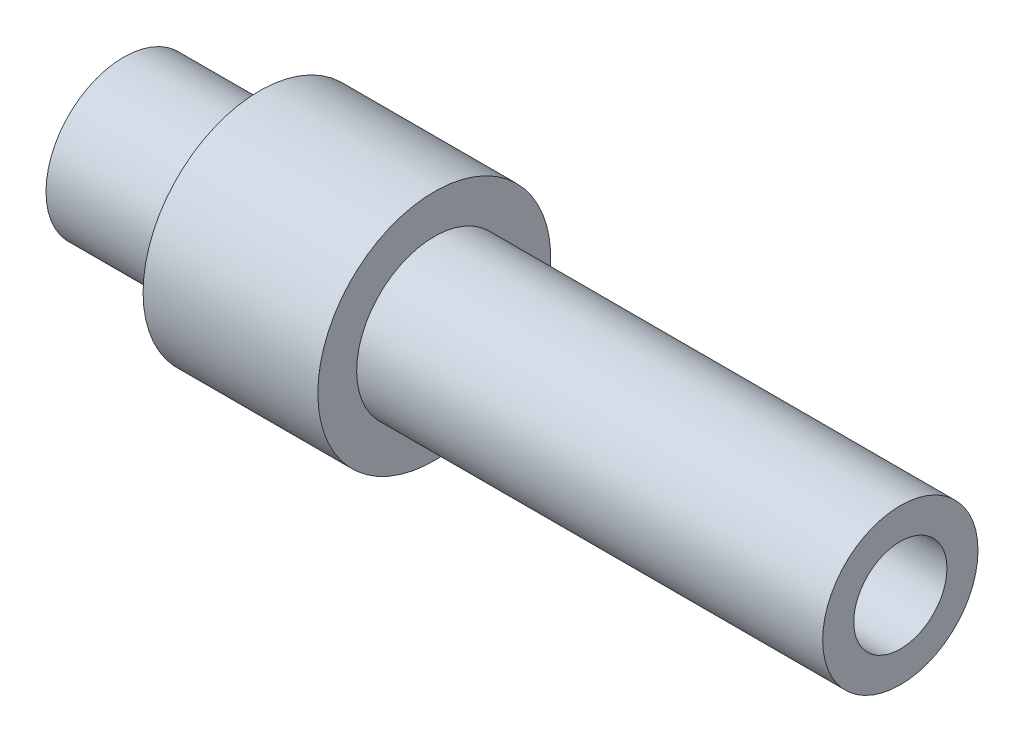
ISO-10303-21;
HEADER;
FILE_DESCRIPTION(('STEP AP214'),'2;1');
FILE_NAME('part.step','',(''),(''),'','','');
FILE_SCHEMA(('AUTOMOTIVE_DESIGN { 1 0 10303 214 1 1 1 1 }'));
ENDSEC;
DATA;
#1=APPLICATION_CONTEXT('core data for automotive mechanical design processes');
#2=APPLICATION_PROTOCOL_DEFINITION('international standard','automotive_design',2000,#1);
#3=PRODUCT_CONTEXT('',#1,'mechanical');
#4=PRODUCT('Part','Part','',(#3));
#5=PRODUCT_RELATED_PRODUCT_CATEGORY('part','',(#4));
#6=PRODUCT_DEFINITION_FORMATION('','',#4);
#7=PRODUCT_DEFINITION_CONTEXT('part definition',#1,'design');
#8=PRODUCT_DEFINITION('design','',#6,#7);
#9=PRODUCT_DEFINITION_SHAPE('','',#8);
#10=(LENGTH_UNIT() NAMED_UNIT(*) SI_UNIT(.MILLI.,.METRE.));
#11=(NAMED_UNIT(*) PLANE_ANGLE_UNIT() SI_UNIT($,.RADIAN.));
#12=(NAMED_UNIT(*) SI_UNIT($,.STERADIAN.) SOLID_ANGLE_UNIT());
#13=UNCERTAINTY_MEASURE_WITH_UNIT(LENGTH_MEASURE(1.E-05),#10,'distance_accuracy_value','');
#14=(GEOMETRIC_REPRESENTATION_CONTEXT(3) GLOBAL_UNCERTAINTY_ASSIGNED_CONTEXT((#13)) GLOBAL_UNIT_ASSIGNED_CONTEXT((#10,
#11,#12)) REPRESENTATION_CONTEXT('',''));
#15=CARTESIAN_POINT('',(0.,0.,0.));
#16=DIRECTION('',(0.,0.,1.));
#17=DIRECTION('',(1.,0.,0.));
#18=AXIS2_PLACEMENT_3D('',#15,#16,#17);
#19=CARTESIAN_POINT('',(40.,0.,0.));
#20=DIRECTION('',(-1.,0.,0.));
#21=DIRECTION('',(0.,0.,1.));
#22=AXIS2_PLACEMENT_3D('',#19,#20,#21);
#23=CYLINDRICAL_SURFACE('',#22,4.);
#24=CARTESIAN_POINT('',(7.,0.,0.));
#25=DIRECTION('',(-1.,0.,0.));
#26=DIRECTION('',(0.,0.,1.));
#27=AXIS2_PLACEMENT_3D('',#24,#25,#26);
#28=CIRCLE('',#27,4.);
#29=CARTESIAN_POINT('',(7.,0.,4.));
#30=VERTEX_POINT('',#29);
#31=EDGE_CURVE('E59',#30,#30,#28,.T.);
#32=ORIENTED_EDGE('',*,*,#31,.T.);
#33=EDGE_LOOP('',(#32));
#34=FACE_BOUND('',#33,.T.);
#35=CARTESIAN_POINT('',(0.,0.,0.));
#36=DIRECTION('',(1.,0.,0.));
#37=DIRECTION('',(0.,0.,-1.));
#38=AXIS2_PLACEMENT_3D('',#35,#36,#37);
#39=CIRCLE('',#38,4.);
#40=CARTESIAN_POINT('',(0.,0.,-4.));
#41=VERTEX_POINT('',#40);
#42=EDGE_CURVE('E49',#41,#41,#39,.T.);
#43=ORIENTED_EDGE('',*,*,#42,.T.);
#44=EDGE_LOOP('',(#43));
#45=FACE_BOUND('',#44,.T.);
#46=ADVANCED_FACE('F39',(#34,#45),#23,.T.);
#47=CARTESIAN_POINT('',(0.,0.,0.));
#48=DIRECTION('',(1.,0.,0.));
#49=DIRECTION('',(0.,0.,-1.));
#50=AXIS2_PLACEMENT_3D('',#47,#48,#49);
#51=PLANE('',#50);
#52=CARTESIAN_POINT('',(0.,0.,0.));
#53=DIRECTION('',(-1.,0.,0.));
#54=DIRECTION('',(0.,0.,1.));
#55=AXIS2_PLACEMENT_3D('',#52,#53,#54);
#56=CIRCLE('',#55,2.);
#57=CARTESIAN_POINT('',(0.,0.,2.));
#58=VERTEX_POINT('',#57);
#59=EDGE_CURVE('E57',#58,#58,#56,.T.);
#60=ORIENTED_EDGE('',*,*,#59,.F.);
#61=EDGE_LOOP('',(#60));
#62=FACE_BOUND('',#61,.T.);
#63=ORIENTED_EDGE('',*,*,#42,.F.);
#64=EDGE_LOOP('',(#63));
#65=FACE_BOUND('',#64,.T.);
#66=ADVANCED_FACE('F84',(#62,#65),#51,.F.);
#67=CARTESIAN_POINT('',(6.,0.,0.));
#68=DIRECTION('',(-1.,0.,0.));
#69=DIRECTION('',(0.,0.,1.));
#70=AXIS2_PLACEMENT_3D('',#67,#68,#69);
#71=CYLINDRICAL_SURFACE('',#70,2.);
#72=CARTESIAN_POINT('',(6.,0.,0.));
#73=DIRECTION('',(-1.,0.,0.));
#74=DIRECTION('',(0.,0.,1.));
#75=AXIS2_PLACEMENT_3D('',#72,#73,#74);
#76=CIRCLE('',#75,2.);
#77=CARTESIAN_POINT('',(6.,0.,2.));
#78=VERTEX_POINT('',#77);
#79=EDGE_CURVE('E54',#78,#78,#76,.T.);
#80=ORIENTED_EDGE('',*,*,#79,.F.);
#81=EDGE_LOOP('',(#80));
#82=FACE_BOUND('',#81,.T.);
#83=ORIENTED_EDGE('',*,*,#59,.T.);
#84=EDGE_LOOP('',(#83));
#85=FACE_BOUND('',#84,.T.);
#86=ADVANCED_FACE('F81',(#82,#85),#71,.F.);
#87=CARTESIAN_POINT('',(6.,0.,0.));
#88=DIRECTION('',(-1.,0.,0.));
#89=DIRECTION('',(0.,0.,1.));
#90=AXIS2_PLACEMENT_3D('',#87,#88,#89);
#91=PLANE('',#90);
#92=ORIENTED_EDGE('',*,*,#79,.T.);
#93=EDGE_LOOP('',(#92));
#94=FACE_BOUND('',#93,.T.);
#95=ADVANCED_FACE('F79',(#94),#91,.T.);
#96=CARTESIAN_POINT('',(16.,0.,0.));
#97=DIRECTION('',(-1.,0.,0.));
#98=DIRECTION('',(0.,0.,1.));
#99=AXIS2_PLACEMENT_3D('',#96,#97,#98);
#100=CYLINDRICAL_SURFACE('',#99,6.);
#101=CARTESIAN_POINT('',(16.,0.,0.));
#102=DIRECTION('',(-1.,0.,0.));
#103=DIRECTION('',(0.,0.,1.));
#104=AXIS2_PLACEMENT_3D('',#101,#102,#103);
#105=CIRCLE('',#104,6.);
#106=CARTESIAN_POINT('',(16.,0.,6.));
#107=VERTEX_POINT('',#106);
#108=EDGE_CURVE('E61',#107,#107,#105,.T.);
#109=ORIENTED_EDGE('',*,*,#108,.T.);
#110=EDGE_LOOP('',(#109));
#111=FACE_BOUND('',#110,.T.);
#112=CARTESIAN_POINT('',(7.,0.,0.));
#113=DIRECTION('',(-1.,0.,0.));
#114=DIRECTION('',(0.,0.,1.));
#115=AXIS2_PLACEMENT_3D('',#112,#113,#114);
#116=CIRCLE('',#115,6.);
#117=CARTESIAN_POINT('',(7.,0.,6.));
#118=VERTEX_POINT('',#117);
#119=EDGE_CURVE('E66',#118,#118,#116,.T.);
#120=ORIENTED_EDGE('',*,*,#119,.F.);
#121=EDGE_LOOP('',(#120));
#122=FACE_BOUND('',#121,.T.);
#123=ADVANCED_FACE('F121',(#111,#122),#100,.T.);
#124=CARTESIAN_POINT('',(16.,0.,0.));
#125=DIRECTION('',(-1.,0.,0.));
#126=DIRECTION('',(0.,0.,1.));
#127=AXIS2_PLACEMENT_3D('',#124,#125,#126);
#128=PLANE('',#127);
#129=CARTESIAN_POINT('',(16.,0.,0.));
#130=DIRECTION('',(-1.,0.,0.));
#131=DIRECTION('',(0.,0.,1.));
#132=AXIS2_PLACEMENT_3D('',#129,#130,#131);
#133=CIRCLE('',#132,4.);
#134=CARTESIAN_POINT('',(16.,0.,4.));
#135=VERTEX_POINT('',#134);
#136=EDGE_CURVE('E10',#135,#135,#133,.T.);
#137=ORIENTED_EDGE('',*,*,#136,.T.);
#138=EDGE_LOOP('',(#137));
#139=FACE_BOUND('',#138,.T.);
#140=ORIENTED_EDGE('',*,*,#108,.F.);
#141=EDGE_LOOP('',(#140));
#142=FACE_BOUND('',#141,.T.);
#143=ADVANCED_FACE('F114',(#139,#142),#128,.F.);
#144=CARTESIAN_POINT('',(7.,0.,0.));
#145=DIRECTION('',(-1.,0.,0.));
#146=DIRECTION('',(0.,0.,1.));
#147=AXIS2_PLACEMENT_3D('',#144,#145,#146);
#148=PLANE('',#147);
#149=ORIENTED_EDGE('',*,*,#31,.F.);
#150=EDGE_LOOP('',(#149));
#151=FACE_BOUND('',#150,.T.);
#152=ORIENTED_EDGE('',*,*,#119,.T.);
#153=EDGE_LOOP('',(#152));
#154=FACE_BOUND('',#153,.T.);
#155=ADVANCED_FACE('F107',(#151,#154),#148,.T.);
#156=CARTESIAN_POINT('',(40.,0.,0.));
#157=DIRECTION('',(1.,0.,0.));
#158=DIRECTION('',(0.,0.,-1.));
#159=AXIS2_PLACEMENT_3D('',#156,#157,#158);
#160=PLANE('',#159);
#161=CARTESIAN_POINT('',(40.,0.,0.));
#162=DIRECTION('',(1.,0.,0.));
#163=DIRECTION('',(0.,0.,-1.));
#164=AXIS2_PLACEMENT_3D('',#161,#162,#163);
#165=CIRCLE('',#164,2.4);
#166=CARTESIAN_POINT('',(40.,0.,-2.4));
#167=VERTEX_POINT('',#166);
#168=EDGE_CURVE('E74',#167,#167,#165,.T.);
#169=ORIENTED_EDGE('',*,*,#168,.F.);
#170=EDGE_LOOP('',(#169));
#171=FACE_BOUND('',#170,.T.);
#172=CARTESIAN_POINT('',(40.,0.,0.));
#173=DIRECTION('',(1.,0.,0.));
#174=DIRECTION('',(0.,0.,-1.));
#175=AXIS2_PLACEMENT_3D('',#172,#173,#174);
#176=CIRCLE('',#175,4.);
#177=CARTESIAN_POINT('',(40.,0.,-4.));
#178=VERTEX_POINT('',#177);
#179=EDGE_CURVE('E45',#178,#178,#176,.T.);
#180=ORIENTED_EDGE('',*,*,#179,.T.);
#181=EDGE_LOOP('',(#180));
#182=FACE_BOUND('',#181,.T.);
#183=ADVANCED_FACE('F98',(#171,#182),#160,.T.);
#184=ORIENTED_EDGE('',*,*,#179,.F.);
#185=EDGE_LOOP('',(#184));
#186=FACE_BOUND('',#185,.T.);
#187=ORIENTED_EDGE('',*,*,#136,.F.);
#188=EDGE_LOOP('',(#187));
#189=FACE_BOUND('',#188,.T.);
#190=ADVANCED_FACE('F93',(#186,#189),#23,.T.);
#191=CARTESIAN_POINT('',(24.,0.,0.));
#192=DIRECTION('',(1.,0.,0.));
#193=DIRECTION('',(0.,0.,-1.));
#194=AXIS2_PLACEMENT_3D('',#191,#192,#193);
#195=CYLINDRICAL_SURFACE('',#194,2.4);
#196=CARTESIAN_POINT('',(24.,0.,0.));
#197=DIRECTION('',(1.,0.,0.));
#198=DIRECTION('',(0.,0.,-1.));
#199=AXIS2_PLACEMENT_3D('',#196,#197,#198);
#200=CIRCLE('',#199,2.4);
#201=CARTESIAN_POINT('',(24.,0.,-2.4));
#202=VERTEX_POINT('',#201);
#203=EDGE_CURVE('E71',#202,#202,#200,.T.);
#204=ORIENTED_EDGE('',*,*,#203,.F.);
#205=EDGE_LOOP('',(#204));
#206=FACE_BOUND('',#205,.T.);
#207=ORIENTED_EDGE('',*,*,#168,.T.);
#208=EDGE_LOOP('',(#207));
#209=FACE_BOUND('',#208,.T.);
#210=ADVANCED_FACE('F97',(#206,#209),#195,.F.);
#211=CARTESIAN_POINT('',(24.,0.,0.));
#212=DIRECTION('',(1.,0.,0.));
#213=DIRECTION('',(0.,0.,-1.));
#214=AXIS2_PLACEMENT_3D('',#211,#212,#213);
#215=PLANE('',#214);
#216=ORIENTED_EDGE('',*,*,#203,.T.);
#217=EDGE_LOOP('',(#216));
#218=FACE_BOUND('',#217,.T.);
#219=ADVANCED_FACE('F104',(#218),#215,.T.);
#220=CLOSED_SHELL('',(#46,#66,#86,#95,#123,#143,#155,#183,#190,#210,#219));
#221=MANIFOLD_SOLID_BREP('B2',#220);
#222=ADVANCED_BREP_SHAPE_REPRESENTATION('',(#18,#221),#14);
#223=SHAPE_DEFINITION_REPRESENTATION(#9,#222);
ENDSEC;
END-ISO-10303-21;
